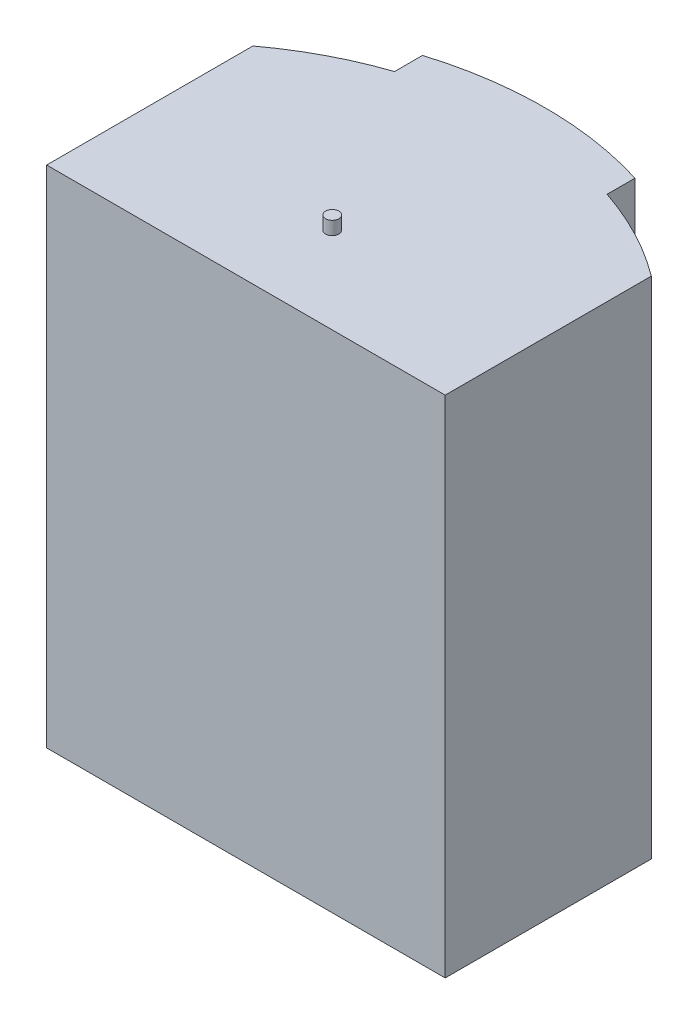
ISO-10303-21;
HEADER;
FILE_DESCRIPTION(('STEP AP214'),'2;1');
FILE_NAME('part.step','',(''),(''),'','','');
FILE_SCHEMA(('AUTOMOTIVE_DESIGN { 1 0 10303 214 1 1 1 1 }'));
ENDSEC;
DATA;
#1=APPLICATION_CONTEXT('core data for automotive mechanical design processes');
#2=APPLICATION_PROTOCOL_DEFINITION('international standard','automotive_design',2000,#1);
#3=PRODUCT_CONTEXT('',#1,'mechanical');
#4=PRODUCT('Part','Part','',(#3));
#5=PRODUCT_RELATED_PRODUCT_CATEGORY('part','',(#4));
#6=PRODUCT_DEFINITION_FORMATION('','',#4);
#7=PRODUCT_DEFINITION_CONTEXT('part definition',#1,'design');
#8=PRODUCT_DEFINITION('design','',#6,#7);
#9=PRODUCT_DEFINITION_SHAPE('','',#8);
#10=(LENGTH_UNIT() NAMED_UNIT(*) SI_UNIT(.MILLI.,.METRE.));
#11=(NAMED_UNIT(*) PLANE_ANGLE_UNIT() SI_UNIT($,.RADIAN.));
#12=(NAMED_UNIT(*) SI_UNIT($,.STERADIAN.) SOLID_ANGLE_UNIT());
#13=UNCERTAINTY_MEASURE_WITH_UNIT(LENGTH_MEASURE(1.E-05),#10,'distance_accuracy_value','');
#14=(GEOMETRIC_REPRESENTATION_CONTEXT(3) GLOBAL_UNCERTAINTY_ASSIGNED_CONTEXT((#13)) GLOBAL_UNIT_ASSIGNED_CONTEXT((#10,
#11,#12)) REPRESENTATION_CONTEXT('',''));
#15=CARTESIAN_POINT('',(0.,0.,0.));
#16=DIRECTION('',(0.,0.,1.));
#17=DIRECTION('',(1.,0.,0.));
#18=AXIS2_PLACEMENT_3D('',#15,#16,#17);
#19=CARTESIAN_POINT('',(0.,0.,240.));
#20=DIRECTION('',(0.,0.,-1.));
#21=DIRECTION('',(-1.,0.,0.));
#22=AXIS2_PLACEMENT_3D('',#19,#20,#21);
#23=PLANE('',#22);
#24=DIRECTION('',(0.,1.,0.));
#25=VECTOR('',#24,1.);
#26=CARTESIAN_POINT('',(-150.,0.,240.));
#27=LINE('',#26,#25);
#28=CARTESIAN_POINT('',(-150.,-190.,240.));
#29=VERTEX_POINT('',#28);
#30=CARTESIAN_POINT('',(-150.,190.,240.));
#31=VERTEX_POINT('',#30);
#32=EDGE_CURVE('E11',#29,#31,#27,.T.);
#33=ORIENTED_EDGE('',*,*,#32,.F.);
#34=DIRECTION('',(-1.,0.,0.));
#35=VECTOR('',#34,1.);
#36=CARTESIAN_POINT('',(0.,-190.,240.));
#37=LINE('',#36,#35);
#38=CARTESIAN_POINT('',(150.,-190.,240.));
#39=VERTEX_POINT('',#38);
#40=EDGE_CURVE('E201',#39,#29,#37,.T.);
#41=ORIENTED_EDGE('',*,*,#40,.F.);
#42=DIRECTION('',(0.,-1.,0.));
#43=VECTOR('',#42,1.);
#44=CARTESIAN_POINT('',(150.,0.,240.));
#45=LINE('',#44,#43);
#46=CARTESIAN_POINT('',(150.,190.,240.));
#47=VERTEX_POINT('',#46);
#48=EDGE_CURVE('E198',#47,#39,#45,.T.);
#49=ORIENTED_EDGE('',*,*,#48,.F.);
#50=DIRECTION('',(-1.,0.,0.));
#51=VECTOR('',#50,1.);
#52=CARTESIAN_POINT('',(0.,190.,240.));
#53=LINE('',#52,#51);
#54=EDGE_CURVE('E55',#47,#31,#53,.T.);
#55=ORIENTED_EDGE('',*,*,#54,.T.);
#56=EDGE_LOOP('',(#33,#41,#49,#55));
#57=FACE_BOUND('',#56,.T.);
#58=ADVANCED_FACE('F45',(#57),#23,.F.);
#59=CARTESIAN_POINT('',(-80.,190.,48.1234279464349));
#60=DIRECTION('',(-1.,0.,0.));
#61=DIRECTION('',(0.,0.,-1.));
#62=AXIS2_PLACEMENT_3D('',#59,#60,#61);
#63=PLANE('',#62);
#64=DIRECTION('',(0.,0.,-1.));
#65=VECTOR('',#64,1.);
#66=CARTESIAN_POINT('',(-80.,190.,48.1234279464349));
#67=LINE('',#66,#65);
#68=CARTESIAN_POINT('',(-80.,190.,48.1234279464349));
#69=VERTEX_POINT('',#68);
#70=CARTESIAN_POINT('',(-80.,190.,27.1089084007463));
#71=VERTEX_POINT('',#70);
#72=EDGE_CURVE('E133',#69,#71,#67,.T.);
#73=ORIENTED_EDGE('',*,*,#72,.T.);
#74=DIRECTION('',(0.,1.,0.));
#75=VECTOR('',#74,1.);
#76=CARTESIAN_POINT('',(-80.,-220.,27.1089084007462));
#77=LINE('',#76,#75);
#78=CARTESIAN_POINT('',(-80.,-190.,27.1089084007462));
#79=VERTEX_POINT('',#78);
#80=EDGE_CURVE('E185',#71,#79,#77,.F.);
#81=ORIENTED_EDGE('',*,*,#80,.T.);
#82=DIRECTION('',(0.,0.,-1.));
#83=VECTOR('',#82,1.);
#84=CARTESIAN_POINT('',(-80.,-190.,48.1234279464349));
#85=LINE('',#84,#83);
#86=CARTESIAN_POINT('',(-80.,-190.,48.1234279464349));
#87=VERTEX_POINT('',#86);
#88=EDGE_CURVE('E153',#87,#79,#85,.T.);
#89=ORIENTED_EDGE('',*,*,#88,.F.);
#90=DIRECTION('',(0.,-1.,0.));
#91=VECTOR('',#90,1.);
#92=CARTESIAN_POINT('',(-80.,190.,48.1234279464349));
#93=LINE('',#92,#91);
#94=EDGE_CURVE('E128',#69,#87,#93,.T.);
#95=ORIENTED_EDGE('',*,*,#94,.F.);
#96=EDGE_LOOP('',(#73,#81,#89,#95));
#97=FACE_BOUND('',#96,.T.);
#98=ADVANCED_FACE('F229',(#97),#63,.T.);
#99=CARTESIAN_POINT('',(0.,220.,285.857230993269));
#100=DIRECTION('',(0.,-1.,0.));
#101=DIRECTION('',(1.,0.,0.));
#102=AXIS2_PLACEMENT_3D('',#99,#100,#101);
#103=CYLINDRICAL_SURFACE('',#102,270.833333333333);
#104=CARTESIAN_POINT('',(0.,190.,285.857230993269));
#105=DIRECTION('',(0.,-1.,0.));
#106=DIRECTION('',(1.,0.,0.));
#107=AXIS2_PLACEMENT_3D('',#104,#105,#106);
#108=CIRCLE('',#107,270.833333333333);
#109=CARTESIAN_POINT('',(79.9999999999999,190.,27.1089084007463));
#110=VERTEX_POINT('',#109);
#111=EDGE_CURVE('E181',#71,#110,#108,.T.);
#112=ORIENTED_EDGE('',*,*,#111,.T.);
#113=DIRECTION('',(0.,1.,0.));
#114=VECTOR('',#113,1.);
#115=CARTESIAN_POINT('',(79.9999999999999,-220.,27.1089084007462));
#116=LINE('',#115,#114);
#117=CARTESIAN_POINT('',(79.9999999999999,-190.,27.1089084007463));
#118=VERTEX_POINT('',#117);
#119=EDGE_CURVE('E194',#118,#110,#116,.T.);
#120=ORIENTED_EDGE('',*,*,#119,.F.);
#121=CARTESIAN_POINT('',(0.,-190.,285.857230993269));
#122=DIRECTION('',(0.,-1.,0.));
#123=DIRECTION('',(1.,0.,0.));
#124=AXIS2_PLACEMENT_3D('',#121,#122,#123);
#125=CIRCLE('',#124,270.833333333333);
#126=EDGE_CURVE('E177',#79,#118,#125,.T.);
#127=ORIENTED_EDGE('',*,*,#126,.F.);
#128=ORIENTED_EDGE('',*,*,#80,.F.);
#129=EDGE_LOOP('',(#112,#120,#127,#128));
#130=FACE_BOUND('',#129,.T.);
#131=ADVANCED_FACE('F235',(#130),#103,.T.);
#132=CARTESIAN_POINT('',(79.9999999999999,190.,48.1234279464349));
#133=DIRECTION('',(1.,0.,0.));
#134=DIRECTION('',(0.,0.,1.));
#135=AXIS2_PLACEMENT_3D('',#132,#133,#134);
#136=PLANE('',#135);
#137=DIRECTION('',(0.,0.,1.));
#138=VECTOR('',#137,1.);
#139=CARTESIAN_POINT('',(79.9999999999999,-190.,48.1234279464349));
#140=LINE('',#139,#138);
#141=CARTESIAN_POINT('',(79.9999999999999,-190.,48.1234279464348));
#142=VERTEX_POINT('',#141);
#143=EDGE_CURVE('E157',#118,#142,#140,.T.);
#144=ORIENTED_EDGE('',*,*,#143,.F.);
#145=ORIENTED_EDGE('',*,*,#119,.T.);
#146=DIRECTION('',(0.,0.,1.));
#147=VECTOR('',#146,1.);
#148=CARTESIAN_POINT('',(79.9999999999999,190.,48.1234279464349));
#149=LINE('',#148,#147);
#150=CARTESIAN_POINT('',(79.9999999999999,190.,48.1234279464348));
#151=VERTEX_POINT('',#150);
#152=EDGE_CURVE('E137',#110,#151,#149,.T.);
#153=ORIENTED_EDGE('',*,*,#152,.T.);
#154=DIRECTION('',(0.,-1.,0.));
#155=VECTOR('',#154,1.);
#156=CARTESIAN_POINT('',(79.9999999999999,190.,48.1234279464348));
#157=LINE('',#156,#155);
#158=EDGE_CURVE('E171',#151,#142,#157,.T.);
#159=ORIENTED_EDGE('',*,*,#158,.T.);
#160=EDGE_LOOP('',(#144,#145,#153,#159));
#161=FACE_BOUND('',#160,.T.);
#162=ADVANCED_FACE('F239',(#161),#136,.T.);
#163=CARTESIAN_POINT('',(0.,190.,285.857230993269));
#164=DIRECTION('',(0.,-1.,0.));
#165=DIRECTION('',(1.,0.,0.));
#166=AXIS2_PLACEMENT_3D('',#163,#164,#165);
#167=CYLINDRICAL_SURFACE('',#166,250.833333333333);
#168=CARTESIAN_POINT('',(0.,-190.,285.857230993269));
#169=DIRECTION('',(0.,-1.,0.));
#170=DIRECTION('',(1.,0.,0.));
#171=AXIS2_PLACEMENT_3D('',#168,#169,#170);
#172=CIRCLE('',#171,250.833333333333);
#173=CARTESIAN_POINT('',(-150.,-190.,84.8165358315408));
#174=VERTEX_POINT('',#173);
#175=EDGE_CURVE('E126',#174,#87,#172,.T.);
#176=ORIENTED_EDGE('',*,*,#175,.F.);
#177=DIRECTION('',(0.,-1.,0.));
#178=VECTOR('',#177,1.);
#179=CARTESIAN_POINT('',(-150.,190.,84.8165358315408));
#180=LINE('',#179,#178);
#181=CARTESIAN_POINT('',(-150.,190.,84.8165358315408));
#182=VERTEX_POINT('',#181);
#183=EDGE_CURVE('E113',#182,#174,#180,.T.);
#184=ORIENTED_EDGE('',*,*,#183,.F.);
#185=CARTESIAN_POINT('',(0.,190.,285.857230993269));
#186=DIRECTION('',(0.,-1.,0.));
#187=DIRECTION('',(1.,0.,0.));
#188=AXIS2_PLACEMENT_3D('',#185,#186,#187);
#189=CIRCLE('',#188,250.833333333333);
#190=EDGE_CURVE('E119',#182,#69,#189,.T.);
#191=ORIENTED_EDGE('',*,*,#190,.T.);
#192=ORIENTED_EDGE('',*,*,#94,.T.);
#193=EDGE_LOOP('',(#176,#184,#191,#192));
#194=FACE_BOUND('',#193,.T.);
#195=ADVANCED_FACE('F124',(#194),#167,.T.);
#196=CARTESIAN_POINT('',(0.,190.,285.857230993269));
#197=DIRECTION('',(0.,-1.,0.));
#198=DIRECTION('',(1.,0.,0.));
#199=AXIS2_PLACEMENT_3D('',#196,#197,#198);
#200=CYLINDRICAL_SURFACE('',#199,250.833333333333);
#201=CARTESIAN_POINT('',(0.,-190.,285.857230993269));
#202=DIRECTION('',(0.,-1.,0.));
#203=DIRECTION('',(1.,0.,0.));
#204=AXIS2_PLACEMENT_3D('',#201,#202,#203);
#205=CIRCLE('',#204,250.833333333333);
#206=CARTESIAN_POINT('',(150.,-190.,84.8165358315407));
#207=VERTEX_POINT('',#206);
#208=EDGE_CURVE('E160',#142,#207,#205,.T.);
#209=ORIENTED_EDGE('',*,*,#208,.F.);
#210=ORIENTED_EDGE('',*,*,#158,.F.);
#211=CARTESIAN_POINT('',(0.,190.,285.857230993269));
#212=DIRECTION('',(0.,-1.,0.));
#213=DIRECTION('',(1.,0.,0.));
#214=AXIS2_PLACEMENT_3D('',#211,#212,#213);
#215=CIRCLE('',#214,250.833333333333);
#216=CARTESIAN_POINT('',(150.,190.,84.8165358315407));
#217=VERTEX_POINT('',#216);
#218=EDGE_CURVE('E142',#151,#217,#215,.T.);
#219=ORIENTED_EDGE('',*,*,#218,.T.);
#220=DIRECTION('',(0.,-1.,0.));
#221=VECTOR('',#220,1.);
#222=CARTESIAN_POINT('',(150.,190.,84.8165358315407));
#223=LINE('',#222,#221);
#224=EDGE_CURVE('E167',#217,#207,#223,.T.);
#225=ORIENTED_EDGE('',*,*,#224,.T.);
#226=EDGE_LOOP('',(#209,#210,#219,#225));
#227=FACE_BOUND('',#226,.T.);
#228=ADVANCED_FACE('F255',(#227),#200,.T.);
#229=CARTESIAN_POINT('',(-150.,190.,315.023897659936));
#230=DIRECTION('',(-1.,0.,0.));
#231=DIRECTION('',(0.,0.,-1.));
#232=AXIS2_PLACEMENT_3D('',#229,#230,#231);
#233=PLANE('',#232);
#234=ORIENTED_EDGE('',*,*,#32,.T.);
#235=DIRECTION('',(0.,0.,-1.));
#236=VECTOR('',#235,1.);
#237=CARTESIAN_POINT('',(-150.,190.,315.023897659936));
#238=LINE('',#237,#236);
#239=EDGE_CURVE('E110',#31,#182,#238,.T.);
#240=ORIENTED_EDGE('',*,*,#239,.T.);
#241=ORIENTED_EDGE('',*,*,#183,.T.);
#242=DIRECTION('',(0.,0.,-1.));
#243=VECTOR('',#242,1.);
#244=CARTESIAN_POINT('',(-150.,-190.,315.023897659936));
#245=LINE('',#244,#243);
#246=EDGE_CURVE('E148',#29,#174,#245,.T.);
#247=ORIENTED_EDGE('',*,*,#246,.F.);
#248=EDGE_LOOP('',(#234,#240,#241,#247));
#249=FACE_BOUND('',#248,.T.);
#250=ADVANCED_FACE('F112',(#249),#233,.T.);
#251=CARTESIAN_POINT('',(150.,190.,315.023897659936));
#252=DIRECTION('',(1.,0.,0.));
#253=DIRECTION('',(0.,0.,1.));
#254=AXIS2_PLACEMENT_3D('',#251,#252,#253);
#255=PLANE('',#254);
#256=ORIENTED_EDGE('',*,*,#48,.T.);
#257=DIRECTION('',(0.,0.,1.));
#258=VECTOR('',#257,1.);
#259=CARTESIAN_POINT('',(150.,-190.,315.023897659936));
#260=LINE('',#259,#258);
#261=EDGE_CURVE('E120',#207,#39,#260,.T.);
#262=ORIENTED_EDGE('',*,*,#261,.F.);
#263=ORIENTED_EDGE('',*,*,#224,.F.);
#264=DIRECTION('',(0.,0.,1.));
#265=VECTOR('',#264,1.);
#266=CARTESIAN_POINT('',(150.,190.,315.023897659936));
#267=LINE('',#266,#265);
#268=EDGE_CURVE('E63',#217,#47,#267,.T.);
#269=ORIENTED_EDGE('',*,*,#268,.T.);
#270=EDGE_LOOP('',(#256,#262,#263,#269));
#271=FACE_BOUND('',#270,.T.);
#272=ADVANCED_FACE('F262',(#271),#255,.T.);
#273=CARTESIAN_POINT('',(0.,-190.,285.857230993269));
#274=DIRECTION('',(0.,-1.,0.));
#275=DIRECTION('',(1.,0.,0.));
#276=AXIS2_PLACEMENT_3D('',#273,#274,#275);
#277=PLANE('',#276);
#278=CARTESIAN_POINT('',(0.,-190.,175.023897659936));
#279=DIRECTION('',(0.,-1.,0.));
#280=DIRECTION('',(1.,0.,0.));
#281=AXIS2_PLACEMENT_3D('',#278,#279,#280);
#282=CIRCLE('',#281,5.);
#283=CARTESIAN_POINT('',(5.,-190.,175.023897659936));
#284=VERTEX_POINT('',#283);
#285=EDGE_CURVE('E170',#284,#284,#282,.T.);
#286=ORIENTED_EDGE('',*,*,#285,.F.);
#287=EDGE_LOOP('',(#286));
#288=FACE_BOUND('',#287,.T.);
#289=ORIENTED_EDGE('',*,*,#40,.T.);
#290=ORIENTED_EDGE('',*,*,#246,.T.);
#291=ORIENTED_EDGE('',*,*,#175,.T.);
#292=ORIENTED_EDGE('',*,*,#88,.T.);
#293=ORIENTED_EDGE('',*,*,#126,.T.);
#294=ORIENTED_EDGE('',*,*,#143,.T.);
#295=ORIENTED_EDGE('',*,*,#208,.T.);
#296=ORIENTED_EDGE('',*,*,#261,.T.);
#297=EDGE_LOOP('',(#289,#290,#291,#292,#293,#294,#295,#296));
#298=FACE_BOUND('',#297,.T.);
#299=ADVANCED_FACE('F258',(#288,#298),#277,.T.);
#300=CARTESIAN_POINT('',(0.,190.,285.857230993269));
#301=DIRECTION('',(0.,-1.,0.));
#302=DIRECTION('',(1.,0.,0.));
#303=AXIS2_PLACEMENT_3D('',#300,#301,#302);
#304=PLANE('',#303);
#305=CARTESIAN_POINT('',(0.,190.,175.023897659936));
#306=DIRECTION('',(0.,-1.,0.));
#307=DIRECTION('',(1.,0.,0.));
#308=AXIS2_PLACEMENT_3D('',#305,#306,#307);
#309=CIRCLE('',#308,5.);
#310=CARTESIAN_POINT('',(5.,190.,175.023897659936));
#311=VERTEX_POINT('',#310);
#312=EDGE_CURVE('E180',#311,#311,#309,.T.);
#313=ORIENTED_EDGE('',*,*,#312,.T.);
#314=EDGE_LOOP('',(#313));
#315=FACE_BOUND('',#314,.T.);
#316=ORIENTED_EDGE('',*,*,#268,.F.);
#317=ORIENTED_EDGE('',*,*,#218,.F.);
#318=ORIENTED_EDGE('',*,*,#152,.F.);
#319=ORIENTED_EDGE('',*,*,#111,.F.);
#320=ORIENTED_EDGE('',*,*,#72,.F.);
#321=ORIENTED_EDGE('',*,*,#190,.F.);
#322=ORIENTED_EDGE('',*,*,#239,.F.);
#323=ORIENTED_EDGE('',*,*,#54,.F.);
#324=EDGE_LOOP('',(#316,#317,#318,#319,#320,#321,#322,#323));
#325=FACE_BOUND('',#324,.T.);
#326=ADVANCED_FACE('F131',(#315,#325),#304,.F.);
#327=CARTESIAN_POINT('',(0.,-220.,175.023897659936));
#328=DIRECTION('',(0.,1.,0.));
#329=DIRECTION('',(-1.,0.,0.));
#330=AXIS2_PLACEMENT_3D('',#327,#328,#329);
#331=CYLINDRICAL_SURFACE('',#330,5.);
#332=ORIENTED_EDGE('',*,*,#285,.T.);
#333=EDGE_LOOP('',(#332));
#334=FACE_BOUND('',#333,.T.);
#335=CARTESIAN_POINT('',(0.,-200.,175.023897659936));
#336=DIRECTION('',(0.,1.,0.));
#337=DIRECTION('',(0.,0.,1.));
#338=AXIS2_PLACEMENT_3D('',#335,#336,#337);
#339=CIRCLE('',#338,5.);
#340=CARTESIAN_POINT('',(0.,-200.,180.023897659936));
#341=VERTEX_POINT('',#340);
#342=EDGE_CURVE('E197',#341,#341,#339,.F.);
#343=ORIENTED_EDGE('',*,*,#342,.F.);
#344=EDGE_LOOP('',(#343));
#345=FACE_BOUND('',#344,.T.);
#346=ADVANCED_FACE('F217',(#334,#345),#331,.T.);
#347=ORIENTED_EDGE('',*,*,#312,.F.);
#348=EDGE_LOOP('',(#347));
#349=FACE_BOUND('',#348,.T.);
#350=CARTESIAN_POINT('',(0.,200.,175.023897659936));
#351=DIRECTION('',(0.,-1.,0.));
#352=DIRECTION('',(0.,0.,-1.));
#353=AXIS2_PLACEMENT_3D('',#350,#351,#352);
#354=CIRCLE('',#353,5.);
#355=CARTESIAN_POINT('',(0.,200.,170.023897659936));
#356=VERTEX_POINT('',#355);
#357=EDGE_CURVE('E49',#356,#356,#354,.F.);
#358=ORIENTED_EDGE('',*,*,#357,.F.);
#359=EDGE_LOOP('',(#358));
#360=FACE_BOUND('',#359,.T.);
#361=ADVANCED_FACE('F214',(#349,#360),#331,.T.);
#362=CARTESIAN_POINT('',(-170.,-200.,240.));
#363=DIRECTION('',(0.,1.,0.));
#364=DIRECTION('',(0.,0.,1.));
#365=AXIS2_PLACEMENT_3D('',#362,#363,#364);
#366=PLANE('',#365);
#367=ORIENTED_EDGE('',*,*,#342,.T.);
#368=EDGE_LOOP('',(#367));
#369=FACE_BOUND('',#368,.T.);
#370=ADVANCED_FACE('F216',(#369),#366,.F.);
#371=CARTESIAN_POINT('',(-170.,200.,240.));
#372=DIRECTION('',(0.,-1.,0.));
#373=DIRECTION('',(0.,0.,-1.));
#374=AXIS2_PLACEMENT_3D('',#371,#372,#373);
#375=PLANE('',#374);
#376=ORIENTED_EDGE('',*,*,#357,.T.);
#377=EDGE_LOOP('',(#376));
#378=FACE_BOUND('',#377,.T.);
#379=ADVANCED_FACE('F47',(#378),#375,.F.);
#380=CLOSED_SHELL('',(#58,#98,#131,#162,#195,#228,#250,#272,#299,#326,#346,#361,#370,#379));
#381=MANIFOLD_SOLID_BREP('B2',#380);
#382=ADVANCED_BREP_SHAPE_REPRESENTATION('',(#18,#381),#14);
#383=SHAPE_DEFINITION_REPRESENTATION(#9,#382);
ENDSEC;
END-ISO-10303-21;
